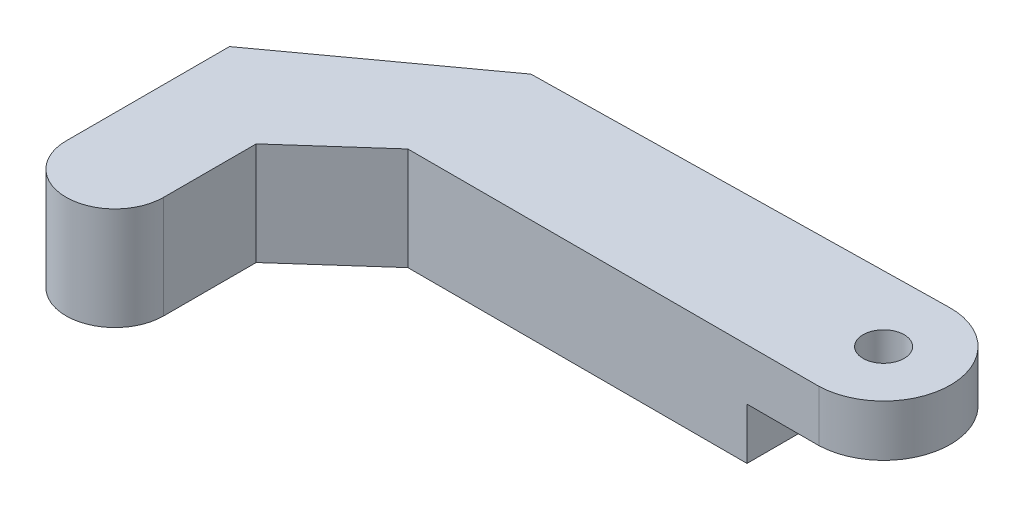
ISO-10303-21;
HEADER;
FILE_DESCRIPTION(('STEP AP214'),'2;1');
FILE_NAME('part.step','',(''),(''),'','','');
FILE_SCHEMA(('AUTOMOTIVE_DESIGN { 1 0 10303 214 1 1 1 1 }'));
ENDSEC;
DATA;
#1=APPLICATION_CONTEXT('core data for automotive mechanical design processes');
#2=APPLICATION_PROTOCOL_DEFINITION('international standard','automotive_design',2000,#1);
#3=PRODUCT_CONTEXT('',#1,'mechanical');
#4=PRODUCT('Part','Part','',(#3));
#5=PRODUCT_RELATED_PRODUCT_CATEGORY('part','',(#4));
#6=PRODUCT_DEFINITION_FORMATION('','',#4);
#7=PRODUCT_DEFINITION_CONTEXT('part definition',#1,'design');
#8=PRODUCT_DEFINITION('design','',#6,#7);
#9=PRODUCT_DEFINITION_SHAPE('','',#8);
#10=(LENGTH_UNIT() NAMED_UNIT(*) SI_UNIT(.MILLI.,.METRE.));
#11=(NAMED_UNIT(*) PLANE_ANGLE_UNIT() SI_UNIT($,.RADIAN.));
#12=(NAMED_UNIT(*) SI_UNIT($,.STERADIAN.) SOLID_ANGLE_UNIT());
#13=UNCERTAINTY_MEASURE_WITH_UNIT(LENGTH_MEASURE(1.E-05),#10,'distance_accuracy_value','');
#14=(GEOMETRIC_REPRESENTATION_CONTEXT(3) GLOBAL_UNCERTAINTY_ASSIGNED_CONTEXT((#13)) GLOBAL_UNIT_ASSIGNED_CONTEXT((#10,
#11,#12)) REPRESENTATION_CONTEXT('',''));
#15=CARTESIAN_POINT('',(0.,0.,0.));
#16=DIRECTION('',(0.,0.,1.));
#17=DIRECTION('',(1.,0.,0.));
#18=AXIS2_PLACEMENT_3D('',#15,#16,#17);
#19=CARTESIAN_POINT('',(0.,10.,0.));
#20=DIRECTION('',(0.,-1.,0.));
#21=DIRECTION('',(0.,0.,-1.));
#22=AXIS2_PLACEMENT_3D('',#19,#20,#21);
#23=CYLINDRICAL_SURFACE('',#22,6.5);
#24=CARTESIAN_POINT('',(0.,5.,0.));
#25=DIRECTION('',(0.,-1.,0.));
#26=DIRECTION('',(0.,0.,-1.));
#27=AXIS2_PLACEMENT_3D('',#24,#25,#26);
#28=CIRCLE('',#27,6.5);
#29=CARTESIAN_POINT('',(-0.113440641842322,5.,-6.49901001851654));
#30=VERTEX_POINT('',#29);
#31=CARTESIAN_POINT('',(0.204691251241143,5.,6.49677623838665));
#32=VERTEX_POINT('',#31);
#33=EDGE_CURVE('E58',#30,#32,#28,.T.);
#34=ORIENTED_EDGE('',*,*,#33,.F.);
#35=DIRECTION('',(0.,-1.,0.));
#36=VECTOR('',#35,1.);
#37=CARTESIAN_POINT('',(-0.113440641842322,10.,-6.49901001851654));
#38=LINE('',#37,#36);
#39=CARTESIAN_POINT('',(-0.113440641842322,10.,-6.49901001851654));
#40=VERTEX_POINT('',#39);
#41=EDGE_CURVE('E11',#40,#30,#38,.T.);
#42=ORIENTED_EDGE('',*,*,#41,.F.);
#43=CARTESIAN_POINT('',(0.,10.,0.));
#44=DIRECTION('',(0.,1.,0.));
#45=DIRECTION('',(0.,0.,-1.));
#46=AXIS2_PLACEMENT_3D('',#43,#44,#45);
#47=CIRCLE('',#46,6.5);
#48=CARTESIAN_POINT('',(0.204691251241143,10.,6.49677623838665));
#49=VERTEX_POINT('',#48);
#50=EDGE_CURVE('E169',#49,#40,#47,.T.);
#51=ORIENTED_EDGE('',*,*,#50,.F.);
#52=DIRECTION('',(0.,-1.,0.));
#53=VECTOR('',#52,1.);
#54=CARTESIAN_POINT('',(0.204691251241143,10.,6.49677623838665));
#55=LINE('',#54,#53);
#56=EDGE_CURVE('E144',#49,#32,#55,.T.);
#57=ORIENTED_EDGE('',*,*,#56,.T.);
#58=EDGE_LOOP('',(#34,#42,#51,#57));
#59=FACE_BOUND('',#58,.T.);
#60=ADVANCED_FACE('F43',(#59),#23,.T.);
#61=CARTESIAN_POINT('',(0.,10.,0.));
#62=DIRECTION('',(0.,-1.,0.));
#63=DIRECTION('',(0.,0.,-1.));
#64=AXIS2_PLACEMENT_3D('',#61,#62,#63);
#65=CYLINDRICAL_SURFACE('',#64,2.);
#66=CARTESIAN_POINT('',(0.,10.,0.));
#67=DIRECTION('',(0.,1.,0.));
#68=DIRECTION('',(0.,0.,1.));
#69=AXIS2_PLACEMENT_3D('',#66,#67,#68);
#70=CIRCLE('',#69,2.);
#71=CARTESIAN_POINT('',(0.,10.,2.));
#72=VERTEX_POINT('',#71);
#73=EDGE_CURVE('E152',#72,#72,#70,.T.);
#74=ORIENTED_EDGE('',*,*,#73,.T.);
#75=EDGE_LOOP('',(#74));
#76=FACE_BOUND('',#75,.T.);
#77=CARTESIAN_POINT('',(0.,5.,0.));
#78=DIRECTION('',(0.,-1.,0.));
#79=DIRECTION('',(0.,0.,-1.));
#80=AXIS2_PLACEMENT_3D('',#77,#78,#79);
#81=CIRCLE('',#80,2.);
#82=CARTESIAN_POINT('',(0.,5.,-2.));
#83=VERTEX_POINT('',#82);
#84=EDGE_CURVE('E231',#83,#83,#81,.T.);
#85=ORIENTED_EDGE('',*,*,#84,.T.);
#86=EDGE_LOOP('',(#85));
#87=FACE_BOUND('',#86,.T.);
#88=ADVANCED_FACE('F247',(#76,#87),#65,.F.);
#89=CARTESIAN_POINT('',(0.,10.,0.));
#90=DIRECTION('',(0.,-1.,0.));
#91=DIRECTION('',(0.,0.,-1.));
#92=AXIS2_PLACEMENT_3D('',#89,#90,#91);
#93=PLANE('',#92);
#94=ORIENTED_EDGE('',*,*,#50,.T.);
#95=DIRECTION('',(-0.999847695156391,0.,0.0174524064372798));
#96=VECTOR('',#95,1.);
#97=CARTESIAN_POINT('',(-40.1134406418423,10.,-5.80080742138799));
#98=LINE('',#97,#96);
#99=CARTESIAN_POINT('',(-40.1134406418423,10.,-5.80080742138799));
#100=VERTEX_POINT('',#99);
#101=EDGE_CURVE('E103',#40,#100,#98,.T.);
#102=ORIENTED_EDGE('',*,*,#101,.T.);
#103=DIRECTION('',(-0.809016994374949,0.,0.587785252292472));
#104=VECTOR('',#103,1.);
#105=CARTESIAN_POINT('',(-57.1027975237162,10.,6.54268287675391));
#106=LINE('',#105,#104);
#107=CARTESIAN_POINT('',(-57.1027975237162,10.,6.54268287675391));
#108=VERTEX_POINT('',#107);
#109=EDGE_CURVE('E191',#100,#108,#106,.T.);
#110=ORIENTED_EDGE('',*,*,#109,.T.);
#111=DIRECTION('',(0.,0.,1.));
#112=VECTOR('',#111,1.);
#113=CARTESIAN_POINT('',(-57.1027975237162,10.,22.4426828767539));
#114=LINE('',#113,#112);
#115=CARTESIAN_POINT('',(-57.1027975237162,10.,22.4426828767539));
#116=VERTEX_POINT('',#115);
#117=EDGE_CURVE('E205',#108,#116,#114,.T.);
#118=ORIENTED_EDGE('',*,*,#117,.T.);
#119=CARTESIAN_POINT('',(-52.3527975237162,10.,22.4426828767539));
#120=DIRECTION('',(0.,1.,0.));
#121=DIRECTION('',(0.,0.,-1.));
#122=AXIS2_PLACEMENT_3D('',#119,#120,#121);
#123=CIRCLE('',#122,4.75);
#124=CARTESIAN_POINT('',(-47.6027975237162,10.,22.4426828767539));
#125=VERTEX_POINT('',#124);
#126=EDGE_CURVE('E126',#116,#125,#123,.T.);
#127=ORIENTED_EDGE('',*,*,#126,.T.);
#128=DIRECTION('',(0.,0.,-1.));
#129=VECTOR('',#128,1.);
#130=CARTESIAN_POINT('',(-47.6027975237162,10.,13.4426828767539));
#131=LINE('',#130,#129);
#132=CARTESIAN_POINT('',(-47.6027975237162,10.,13.4426828767539));
#133=VERTEX_POINT('',#132);
#134=EDGE_CURVE('E119',#125,#133,#131,.T.);
#135=ORIENTED_EDGE('',*,*,#134,.T.);
#136=DIRECTION('',(0.747128112436113,0.,-0.664680061087777));
#137=VECTOR('',#136,1.);
#138=CARTESIAN_POINT('',(-39.7953087487589,10.,6.49677623838665));
#139=LINE('',#138,#137);
#140=CARTESIAN_POINT('',(-39.7953087487589,10.,6.49677623838665));
#141=VERTEX_POINT('',#140);
#142=EDGE_CURVE('E124',#133,#141,#139,.T.);
#143=ORIENTED_EDGE('',*,*,#142,.T.);
#144=DIRECTION('',(1.,0.,0.));
#145=VECTOR('',#144,1.);
#146=CARTESIAN_POINT('',(0.204691251241143,10.,6.49677623838665));
#147=LINE('',#146,#145);
#148=EDGE_CURVE('E67',#141,#49,#147,.T.);
#149=ORIENTED_EDGE('',*,*,#148,.T.);
#150=EDGE_LOOP('',(#94,#102,#110,#118,#127,#135,#143,#149));
#151=FACE_BOUND('',#150,.T.);
#152=ORIENTED_EDGE('',*,*,#73,.F.);
#153=EDGE_LOOP('',(#152));
#154=FACE_BOUND('',#153,.T.);
#155=ADVANCED_FACE('F121',(#151,#154),#93,.F.);
#156=CARTESIAN_POINT('',(0.,0.,0.));
#157=DIRECTION('',(0.,-1.,0.));
#158=DIRECTION('',(0.,0.,-1.));
#159=AXIS2_PLACEMENT_3D('',#156,#157,#158);
#160=PLANE('',#159);
#161=DIRECTION('',(0.,0.,-1.));
#162=VECTOR('',#161,1.);
#163=CARTESIAN_POINT('',(-6.79530874875886,0.,6.49677623838665));
#164=LINE('',#163,#162);
#165=CARTESIAN_POINT('',(-6.79530874875886,0.,6.49677623838665));
#166=VERTEX_POINT('',#165);
#167=CARTESIAN_POINT('',(-6.79530874875886,0.,-6.38237757686855));
#168=VERTEX_POINT('',#167);
#169=EDGE_CURVE('E227',#166,#168,#164,.T.);
#170=ORIENTED_EDGE('',*,*,#169,.F.);
#171=DIRECTION('',(1.,0.,0.));
#172=VECTOR('',#171,1.);
#173=CARTESIAN_POINT('',(0.204691251241143,0.,6.49677623838665));
#174=LINE('',#173,#172);
#175=CARTESIAN_POINT('',(-39.7953087487589,0.,6.49677623838665));
#176=VERTEX_POINT('',#175);
#177=EDGE_CURVE('E165',#176,#166,#174,.T.);
#178=ORIENTED_EDGE('',*,*,#177,.F.);
#179=DIRECTION('',(0.747128112436113,0.,-0.664680061087777));
#180=VECTOR('',#179,1.);
#181=CARTESIAN_POINT('',(-39.7953087487589,0.,6.49677623838665));
#182=LINE('',#181,#180);
#183=CARTESIAN_POINT('',(-47.6027975237162,0.,13.4426828767539));
#184=VERTEX_POINT('',#183);
#185=EDGE_CURVE('E95',#184,#176,#182,.T.);
#186=ORIENTED_EDGE('',*,*,#185,.F.);
#187=DIRECTION('',(0.,0.,-1.));
#188=VECTOR('',#187,1.);
#189=CARTESIAN_POINT('',(-47.6027975237162,0.,13.4426828767539));
#190=LINE('',#189,#188);
#191=CARTESIAN_POINT('',(-47.6027975237162,0.,22.4426828767539));
#192=VERTEX_POINT('',#191);
#193=EDGE_CURVE('E135',#192,#184,#190,.T.);
#194=ORIENTED_EDGE('',*,*,#193,.F.);
#195=CARTESIAN_POINT('',(-52.3527975237162,0.,22.4426828767539));
#196=DIRECTION('',(0.,1.,0.));
#197=DIRECTION('',(0.,0.,-1.));
#198=AXIS2_PLACEMENT_3D('',#195,#196,#197);
#199=CIRCLE('',#198,4.75);
#200=CARTESIAN_POINT('',(-57.1027975237162,0.,22.4426828767539));
#201=VERTEX_POINT('',#200);
#202=EDGE_CURVE('E158',#201,#192,#199,.T.);
#203=ORIENTED_EDGE('',*,*,#202,.F.);
#204=DIRECTION('',(0.,0.,1.));
#205=VECTOR('',#204,1.);
#206=CARTESIAN_POINT('',(-57.1027975237162,0.,22.4426828767539));
#207=LINE('',#206,#205);
#208=CARTESIAN_POINT('',(-57.1027975237162,0.,6.54268287675391));
#209=VERTEX_POINT('',#208);
#210=EDGE_CURVE('E155',#209,#201,#207,.T.);
#211=ORIENTED_EDGE('',*,*,#210,.F.);
#212=DIRECTION('',(-0.809016994374949,0.,0.587785252292472));
#213=VECTOR('',#212,1.);
#214=CARTESIAN_POINT('',(-57.1027975237162,0.,6.54268287675391));
#215=LINE('',#214,#213);
#216=CARTESIAN_POINT('',(-40.1134406418423,0.,-5.80080742138799));
#217=VERTEX_POINT('',#216);
#218=EDGE_CURVE('E151',#217,#209,#215,.T.);
#219=ORIENTED_EDGE('',*,*,#218,.F.);
#220=DIRECTION('',(-0.999847695156391,0.,0.0174524064372798));
#221=VECTOR('',#220,1.);
#222=CARTESIAN_POINT('',(-40.1134406418423,0.,-5.80080742138799));
#223=LINE('',#222,#221);
#224=EDGE_CURVE('E148',#168,#217,#223,.T.);
#225=ORIENTED_EDGE('',*,*,#224,.F.);
#226=EDGE_LOOP('',(#170,#178,#186,#194,#203,#211,#219,#225));
#227=FACE_BOUND('',#226,.T.);
#228=ADVANCED_FACE('F196',(#227),#160,.T.);
#229=CARTESIAN_POINT('',(-40.1134406418423,10.,-5.80080742138799));
#230=DIRECTION('',(0.0174524064372798,0.,0.999847695156391));
#231=DIRECTION('',(0.999847695156391,0.,-0.0174524064372798));
#232=AXIS2_PLACEMENT_3D('',#229,#230,#231);
#233=PLANE('',#232);
#234=DIRECTION('',(0.999847695156391,0.,-0.0174524064372797));
#235=VECTOR('',#234,1.);
#236=CARTESIAN_POINT('',(-6.79530874875886,5.,-6.38237757686855));
#237=LINE('',#236,#235);
#238=CARTESIAN_POINT('',(-6.79530874875886,5.,-6.38237757686855));
#239=VERTEX_POINT('',#238);
#240=EDGE_CURVE('E223',#239,#30,#237,.T.);
#241=ORIENTED_EDGE('',*,*,#240,.F.);
#242=DIRECTION('',(0.,-1.,0.));
#243=VECTOR('',#242,1.);
#244=CARTESIAN_POINT('',(-6.79530874875886,5.,-6.38237757686855));
#245=LINE('',#244,#243);
#246=EDGE_CURVE('E218',#239,#168,#245,.T.);
#247=ORIENTED_EDGE('',*,*,#246,.T.);
#248=ORIENTED_EDGE('',*,*,#224,.T.);
#249=DIRECTION('',(0.,-1.,0.));
#250=VECTOR('',#249,1.);
#251=CARTESIAN_POINT('',(-40.1134406418423,10.,-5.80080742138799));
#252=LINE('',#251,#250);
#253=EDGE_CURVE('E51',#100,#217,#252,.T.);
#254=ORIENTED_EDGE('',*,*,#253,.F.);
#255=ORIENTED_EDGE('',*,*,#101,.F.);
#256=ORIENTED_EDGE('',*,*,#41,.T.);
#257=EDGE_LOOP('',(#241,#247,#248,#254,#255,#256));
#258=FACE_BOUND('',#257,.T.);
#259=ADVANCED_FACE('F271',(#258),#233,.F.);
#260=CARTESIAN_POINT('',(-57.1027975237162,10.,6.54268287675391));
#261=DIRECTION('',(0.587785252292472,0.,0.809016994374949));
#262=DIRECTION('',(0.809016994374949,0.,-0.587785252292472));
#263=AXIS2_PLACEMENT_3D('',#260,#261,#262);
#264=PLANE('',#263);
#265=ORIENTED_EDGE('',*,*,#218,.T.);
#266=DIRECTION('',(0.,-1.,0.));
#267=VECTOR('',#266,1.);
#268=CARTESIAN_POINT('',(-57.1027975237162,10.,6.54268287675391));
#269=LINE('',#268,#267);
#270=EDGE_CURVE('E181',#108,#209,#269,.T.);
#271=ORIENTED_EDGE('',*,*,#270,.F.);
#272=ORIENTED_EDGE('',*,*,#109,.F.);
#273=ORIENTED_EDGE('',*,*,#253,.T.);
#274=EDGE_LOOP('',(#265,#271,#272,#273));
#275=FACE_BOUND('',#274,.T.);
#276=ADVANCED_FACE('F189',(#275),#264,.F.);
#277=CARTESIAN_POINT('',(-57.1027975237162,10.,22.4426828767539));
#278=DIRECTION('',(1.,0.,0.));
#279=DIRECTION('',(0.,0.,-1.));
#280=AXIS2_PLACEMENT_3D('',#277,#278,#279);
#281=PLANE('',#280);
#282=ORIENTED_EDGE('',*,*,#210,.T.);
#283=DIRECTION('',(0.,-1.,0.));
#284=VECTOR('',#283,1.);
#285=CARTESIAN_POINT('',(-57.1027975237162,10.,22.4426828767539));
#286=LINE('',#285,#284);
#287=EDGE_CURVE('E177',#116,#201,#286,.T.);
#288=ORIENTED_EDGE('',*,*,#287,.F.);
#289=ORIENTED_EDGE('',*,*,#117,.F.);
#290=ORIENTED_EDGE('',*,*,#270,.T.);
#291=EDGE_LOOP('',(#282,#288,#289,#290));
#292=FACE_BOUND('',#291,.T.);
#293=ADVANCED_FACE('F200',(#292),#281,.F.);
#294=CARTESIAN_POINT('',(-52.3527975237162,10.,22.4426828767539));
#295=DIRECTION('',(0.,-1.,0.));
#296=DIRECTION('',(0.,0.,-1.));
#297=AXIS2_PLACEMENT_3D('',#294,#295,#296);
#298=CYLINDRICAL_SURFACE('',#297,4.75);
#299=ORIENTED_EDGE('',*,*,#202,.T.);
#300=DIRECTION('',(0.,-1.,0.));
#301=VECTOR('',#300,1.);
#302=CARTESIAN_POINT('',(-47.6027975237162,10.,22.4426828767539));
#303=LINE('',#302,#301);
#304=EDGE_CURVE('E137',#125,#192,#303,.T.);
#305=ORIENTED_EDGE('',*,*,#304,.F.);
#306=ORIENTED_EDGE('',*,*,#126,.F.);
#307=ORIENTED_EDGE('',*,*,#287,.T.);
#308=EDGE_LOOP('',(#299,#305,#306,#307));
#309=FACE_BOUND('',#308,.T.);
#310=ADVANCED_FACE('F203',(#309),#298,.T.);
#311=CARTESIAN_POINT('',(-47.6027975237162,10.,13.4426828767539));
#312=DIRECTION('',(-1.,0.,0.));
#313=DIRECTION('',(0.,0.,1.));
#314=AXIS2_PLACEMENT_3D('',#311,#312,#313);
#315=PLANE('',#314);
#316=ORIENTED_EDGE('',*,*,#193,.T.);
#317=DIRECTION('',(0.,-1.,0.));
#318=VECTOR('',#317,1.);
#319=CARTESIAN_POINT('',(-47.6027975237162,10.,13.4426828767539));
#320=LINE('',#319,#318);
#321=EDGE_CURVE('E132',#133,#184,#320,.T.);
#322=ORIENTED_EDGE('',*,*,#321,.F.);
#323=ORIENTED_EDGE('',*,*,#134,.F.);
#324=ORIENTED_EDGE('',*,*,#304,.T.);
#325=EDGE_LOOP('',(#316,#322,#323,#324));
#326=FACE_BOUND('',#325,.T.);
#327=ADVANCED_FACE('F133',(#326),#315,.F.);
#328=CARTESIAN_POINT('',(-39.7953087487589,10.,6.49677623838665));
#329=DIRECTION('',(-0.664680061087777,0.,-0.747128112436113));
#330=DIRECTION('',(-0.747128112436113,0.,0.664680061087777));
#331=AXIS2_PLACEMENT_3D('',#328,#329,#330);
#332=PLANE('',#331);
#333=ORIENTED_EDGE('',*,*,#185,.T.);
#334=DIRECTION('',(0.,-1.,0.));
#335=VECTOR('',#334,1.);
#336=CARTESIAN_POINT('',(-39.7953087487589,10.,6.49677623838665));
#337=LINE('',#336,#335);
#338=EDGE_CURVE('E138',#141,#176,#337,.T.);
#339=ORIENTED_EDGE('',*,*,#338,.F.);
#340=ORIENTED_EDGE('',*,*,#142,.F.);
#341=ORIENTED_EDGE('',*,*,#321,.T.);
#342=EDGE_LOOP('',(#333,#339,#340,#341));
#343=FACE_BOUND('',#342,.T.);
#344=ADVANCED_FACE('F140',(#343),#332,.F.);
#345=CARTESIAN_POINT('',(0.204691251241143,10.,6.49677623838665));
#346=DIRECTION('',(0.,0.,-1.));
#347=DIRECTION('',(-1.,0.,0.));
#348=AXIS2_PLACEMENT_3D('',#345,#346,#347);
#349=PLANE('',#348);
#350=ORIENTED_EDGE('',*,*,#177,.T.);
#351=DIRECTION('',(0.,-1.,0.));
#352=VECTOR('',#351,1.);
#353=CARTESIAN_POINT('',(-6.79530874875886,5.,6.49677623838665));
#354=LINE('',#353,#352);
#355=CARTESIAN_POINT('',(-6.79530874875886,5.,6.49677623838665));
#356=VERTEX_POINT('',#355);
#357=EDGE_CURVE('E219',#356,#166,#354,.T.);
#358=ORIENTED_EDGE('',*,*,#357,.F.);
#359=DIRECTION('',(-1.,0.,0.));
#360=VECTOR('',#359,1.);
#361=CARTESIAN_POINT('',(0.204691251241143,5.,6.49677623838665));
#362=LINE('',#361,#360);
#363=EDGE_CURVE('E238',#32,#356,#362,.T.);
#364=ORIENTED_EDGE('',*,*,#363,.F.);
#365=ORIENTED_EDGE('',*,*,#56,.F.);
#366=ORIENTED_EDGE('',*,*,#148,.F.);
#367=ORIENTED_EDGE('',*,*,#338,.T.);
#368=EDGE_LOOP('',(#350,#358,#364,#365,#366,#367));
#369=FACE_BOUND('',#368,.T.);
#370=ADVANCED_FACE('F256',(#369),#349,.F.);
#371=CARTESIAN_POINT('',(-6.79530874875886,5.,6.49677623838665));
#372=DIRECTION('',(-1.,0.,0.));
#373=DIRECTION('',(0.,0.,1.));
#374=AXIS2_PLACEMENT_3D('',#371,#372,#373);
#375=PLANE('',#374);
#376=ORIENTED_EDGE('',*,*,#169,.T.);
#377=ORIENTED_EDGE('',*,*,#246,.F.);
#378=DIRECTION('',(0.,0.,-1.));
#379=VECTOR('',#378,1.);
#380=CARTESIAN_POINT('',(-6.79530874875886,5.,6.49677623838665));
#381=LINE('',#380,#379);
#382=EDGE_CURVE('E234',#356,#239,#381,.T.);
#383=ORIENTED_EDGE('',*,*,#382,.F.);
#384=ORIENTED_EDGE('',*,*,#357,.T.);
#385=EDGE_LOOP('',(#376,#377,#383,#384));
#386=FACE_BOUND('',#385,.T.);
#387=ADVANCED_FACE('F251',(#386),#375,.F.);
#388=CARTESIAN_POINT('',(0.,5.,0.));
#389=DIRECTION('',(0.,-1.,0.));
#390=DIRECTION('',(0.,0.,-1.));
#391=AXIS2_PLACEMENT_3D('',#388,#389,#390);
#392=PLANE('',#391);
#393=ORIENTED_EDGE('',*,*,#84,.F.);
#394=EDGE_LOOP('',(#393));
#395=FACE_BOUND('',#394,.T.);
#396=ORIENTED_EDGE('',*,*,#33,.T.);
#397=ORIENTED_EDGE('',*,*,#363,.T.);
#398=ORIENTED_EDGE('',*,*,#382,.T.);
#399=ORIENTED_EDGE('',*,*,#240,.T.);
#400=EDGE_LOOP('',(#396,#397,#398,#399));
#401=FACE_BOUND('',#400,.T.);
#402=ADVANCED_FACE('F249',(#395,#401),#392,.T.);
#403=CLOSED_SHELL('',(#60,#88,#155,#228,#259,#276,#293,#310,#327,#344,#370,#387,#402));
#404=MANIFOLD_SOLID_BREP('B2',#403);
#405=ADVANCED_BREP_SHAPE_REPRESENTATION('',(#18,#404),#14);
#406=SHAPE_DEFINITION_REPRESENTATION(#9,#405);
ENDSEC;
END-ISO-10303-21;
